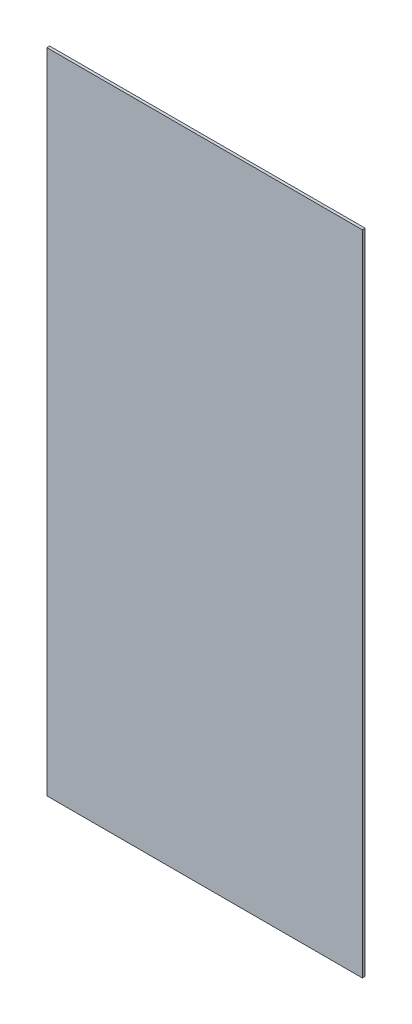
ISO-10303-21;
HEADER;
FILE_DESCRIPTION(('STEP AP214'),'2;1');
FILE_NAME('part.step','',(''),(''),'','','');
FILE_SCHEMA(('AUTOMOTIVE_DESIGN { 1 0 10303 214 1 1 1 1 }'));
ENDSEC;
DATA;
#1=APPLICATION_CONTEXT('core data for automotive mechanical design processes');
#2=APPLICATION_PROTOCOL_DEFINITION('international standard','automotive_design',2000,#1);
#3=PRODUCT_CONTEXT('',#1,'mechanical');
#4=PRODUCT('Part','Part','',(#3));
#5=PRODUCT_RELATED_PRODUCT_CATEGORY('part','',(#4));
#6=PRODUCT_DEFINITION_FORMATION('','',#4);
#7=PRODUCT_DEFINITION_CONTEXT('part definition',#1,'design');
#8=PRODUCT_DEFINITION('design','',#6,#7);
#9=PRODUCT_DEFINITION_SHAPE('','',#8);
#10=(LENGTH_UNIT() NAMED_UNIT(*) SI_UNIT(.MILLI.,.METRE.));
#11=(NAMED_UNIT(*) PLANE_ANGLE_UNIT() SI_UNIT($,.RADIAN.));
#12=(NAMED_UNIT(*) SI_UNIT($,.STERADIAN.) SOLID_ANGLE_UNIT());
#13=UNCERTAINTY_MEASURE_WITH_UNIT(LENGTH_MEASURE(1.E-05),#10,'distance_accuracy_value','');
#14=(GEOMETRIC_REPRESENTATION_CONTEXT(3) GLOBAL_UNCERTAINTY_ASSIGNED_CONTEXT((#13)) GLOBAL_UNIT_ASSIGNED_CONTEXT((#10,
#11,#12)) REPRESENTATION_CONTEXT('',''));
#15=CARTESIAN_POINT('',(0.,0.,0.));
#16=DIRECTION('',(0.,0.,1.));
#17=DIRECTION('',(1.,0.,0.));
#18=AXIS2_PLACEMENT_3D('',#15,#16,#17);
#19=CARTESIAN_POINT('',(0.,0.,4.7625));
#20=DIRECTION('',(1.,0.,0.));
#21=DIRECTION('',(0.,0.,-1.));
#22=AXIS2_PLACEMENT_3D('',#19,#20,#21);
#23=PLANE('',#22);
#24=DIRECTION('',(0.,-1.,0.));
#25=VECTOR('',#24,1.);
#26=CARTESIAN_POINT('',(0.,0.,0.));
#27=LINE('',#26,#25);
#28=CARTESIAN_POINT('',(0.,1095.375,0.));
#29=VERTEX_POINT('',#28);
#30=CARTESIAN_POINT('',(0.,0.,0.));
#31=VERTEX_POINT('',#30);
#32=EDGE_CURVE('E94',#29,#31,#27,.T.);
#33=ORIENTED_EDGE('',*,*,#32,.T.);
#34=DIRECTION('',(0.,0.,-1.));
#35=VECTOR('',#34,1.);
#36=CARTESIAN_POINT('',(0.,0.,4.7625));
#37=LINE('',#36,#35);
#38=CARTESIAN_POINT('',(0.,0.,4.7625));
#39=VERTEX_POINT('',#38);
#40=EDGE_CURVE('E11',#39,#31,#37,.T.);
#41=ORIENTED_EDGE('',*,*,#40,.F.);
#42=DIRECTION('',(0.,-1.,0.));
#43=VECTOR('',#42,1.);
#44=CARTESIAN_POINT('',(0.,0.,4.7625));
#45=LINE('',#44,#43);
#46=CARTESIAN_POINT('',(0.,1095.375,4.7625));
#47=VERTEX_POINT('',#46);
#48=EDGE_CURVE('E82',#47,#39,#45,.T.);
#49=ORIENTED_EDGE('',*,*,#48,.F.);
#50=DIRECTION('',(0.,0.,-1.));
#51=VECTOR('',#50,1.);
#52=CARTESIAN_POINT('',(0.,1095.375,4.7625));
#53=LINE('',#52,#51);
#54=EDGE_CURVE('E90',#47,#29,#53,.T.);
#55=ORIENTED_EDGE('',*,*,#54,.T.);
#56=EDGE_LOOP('',(#33,#41,#49,#55));
#57=FACE_BOUND('',#56,.T.);
#58=ADVANCED_FACE('F31',(#57),#23,.F.);
#59=CARTESIAN_POINT('',(0.,0.,4.7625));
#60=DIRECTION('',(0.,1.,0.));
#61=DIRECTION('',(0.,0.,1.));
#62=AXIS2_PLACEMENT_3D('',#59,#60,#61);
#63=PLANE('',#62);
#64=DIRECTION('',(1.,0.,0.));
#65=VECTOR('',#64,1.);
#66=CARTESIAN_POINT('',(0.,0.,0.));
#67=LINE('',#66,#65);
#68=CARTESIAN_POINT('',(533.4,0.,0.));
#69=VERTEX_POINT('',#68);
#70=EDGE_CURVE('E86',#31,#69,#67,.T.);
#71=ORIENTED_EDGE('',*,*,#70,.T.);
#72=DIRECTION('',(0.,0.,-1.));
#73=VECTOR('',#72,1.);
#74=CARTESIAN_POINT('',(533.4,0.,4.7625));
#75=LINE('',#74,#73);
#76=CARTESIAN_POINT('',(533.4,0.,4.7625));
#77=VERTEX_POINT('',#76);
#78=EDGE_CURVE('E39',#77,#69,#75,.T.);
#79=ORIENTED_EDGE('',*,*,#78,.F.);
#80=DIRECTION('',(1.,0.,0.));
#81=VECTOR('',#80,1.);
#82=CARTESIAN_POINT('',(0.,0.,4.7625));
#83=LINE('',#82,#81);
#84=EDGE_CURVE('E77',#39,#77,#83,.T.);
#85=ORIENTED_EDGE('',*,*,#84,.F.);
#86=ORIENTED_EDGE('',*,*,#40,.T.);
#87=EDGE_LOOP('',(#71,#79,#85,#86));
#88=FACE_BOUND('',#87,.T.);
#89=ADVANCED_FACE('F85',(#88),#63,.F.);
#90=CARTESIAN_POINT('',(533.4,0.,4.7625));
#91=DIRECTION('',(-1.,0.,0.));
#92=DIRECTION('',(0.,0.,1.));
#93=AXIS2_PLACEMENT_3D('',#90,#91,#92);
#94=PLANE('',#93);
#95=DIRECTION('',(0.,1.,0.));
#96=VECTOR('',#95,1.);
#97=CARTESIAN_POINT('',(533.4,0.,0.));
#98=LINE('',#97,#96);
#99=CARTESIAN_POINT('',(533.4,1095.375,0.));
#100=VERTEX_POINT('',#99);
#101=EDGE_CURVE('E64',#69,#100,#98,.T.);
#102=ORIENTED_EDGE('',*,*,#101,.T.);
#103=DIRECTION('',(0.,0.,-1.));
#104=VECTOR('',#103,1.);
#105=CARTESIAN_POINT('',(533.4,1095.375,4.7625));
#106=LINE('',#105,#104);
#107=CARTESIAN_POINT('',(533.4,1095.375,4.7625));
#108=VERTEX_POINT('',#107);
#109=EDGE_CURVE('E87',#108,#100,#106,.T.);
#110=ORIENTED_EDGE('',*,*,#109,.F.);
#111=DIRECTION('',(0.,1.,0.));
#112=VECTOR('',#111,1.);
#113=CARTESIAN_POINT('',(533.4,0.,4.7625));
#114=LINE('',#113,#112);
#115=EDGE_CURVE('E80',#77,#108,#114,.T.);
#116=ORIENTED_EDGE('',*,*,#115,.F.);
#117=ORIENTED_EDGE('',*,*,#78,.T.);
#118=EDGE_LOOP('',(#102,#110,#116,#117));
#119=FACE_BOUND('',#118,.T.);
#120=ADVANCED_FACE('F88',(#119),#94,.F.);
#121=CARTESIAN_POINT('',(0.,1095.375,4.7625));
#122=DIRECTION('',(0.,-1.,0.));
#123=DIRECTION('',(0.,0.,-1.));
#124=AXIS2_PLACEMENT_3D('',#121,#122,#123);
#125=PLANE('',#124);
#126=DIRECTION('',(-1.,0.,0.));
#127=VECTOR('',#126,1.);
#128=CARTESIAN_POINT('',(0.,1095.375,0.));
#129=LINE('',#128,#127);
#130=EDGE_CURVE('E70',#100,#29,#129,.T.);
#131=ORIENTED_EDGE('',*,*,#130,.T.);
#132=ORIENTED_EDGE('',*,*,#54,.F.);
#133=DIRECTION('',(-1.,0.,0.));
#134=VECTOR('',#133,1.);
#135=CARTESIAN_POINT('',(0.,1095.375,4.7625));
#136=LINE('',#135,#134);
#137=EDGE_CURVE('E47',#108,#47,#136,.T.);
#138=ORIENTED_EDGE('',*,*,#137,.F.);
#139=ORIENTED_EDGE('',*,*,#109,.T.);
#140=EDGE_LOOP('',(#131,#132,#138,#139));
#141=FACE_BOUND('',#140,.T.);
#142=ADVANCED_FACE('F101',(#141),#125,.F.);
#143=CARTESIAN_POINT('',(0.,1095.375,4.7625));
#144=DIRECTION('',(0.,0.,-1.));
#145=DIRECTION('',(-1.,0.,0.));
#146=AXIS2_PLACEMENT_3D('',#143,#144,#145);
#147=PLANE('',#146);
#148=ORIENTED_EDGE('',*,*,#48,.T.);
#149=ORIENTED_EDGE('',*,*,#84,.T.);
#150=ORIENTED_EDGE('',*,*,#115,.T.);
#151=ORIENTED_EDGE('',*,*,#137,.T.);
#152=EDGE_LOOP('',(#148,#149,#150,#151));
#153=FACE_BOUND('',#152,.T.);
#154=ADVANCED_FACE('F78',(#153),#147,.F.);
#155=CARTESIAN_POINT('',(0.,1095.375,0.));
#156=DIRECTION('',(0.,0.,-1.));
#157=DIRECTION('',(-1.,0.,0.));
#158=AXIS2_PLACEMENT_3D('',#155,#156,#157);
#159=PLANE('',#158);
#160=ORIENTED_EDGE('',*,*,#32,.F.);
#161=ORIENTED_EDGE('',*,*,#130,.F.);
#162=ORIENTED_EDGE('',*,*,#101,.F.);
#163=ORIENTED_EDGE('',*,*,#70,.F.);
#164=EDGE_LOOP('',(#160,#161,#162,#163));
#165=FACE_BOUND('',#164,.T.);
#166=ADVANCED_FACE('F104',(#165),#159,.T.);
#167=CLOSED_SHELL('',(#58,#89,#120,#142,#154,#166));
#168=MANIFOLD_SOLID_BREP('B2',#167);
#169=ADVANCED_BREP_SHAPE_REPRESENTATION('',(#18,#168),#14);
#170=SHAPE_DEFINITION_REPRESENTATION(#9,#169);
ENDSEC;
END-ISO-10303-21;
